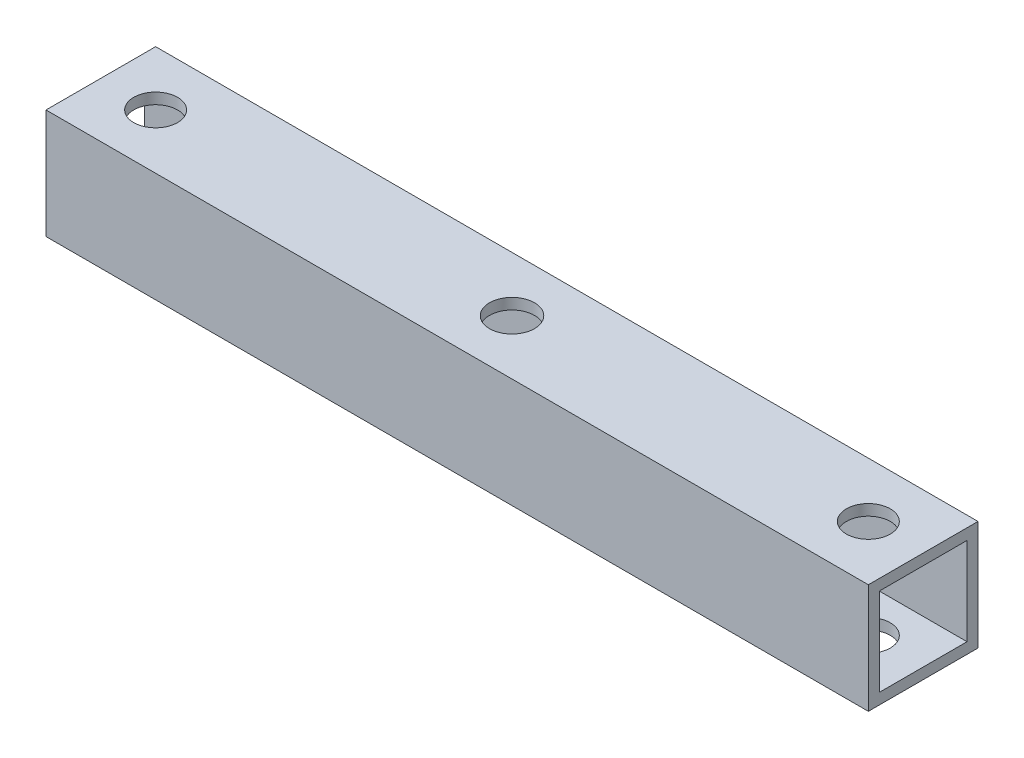
ISO-10303-21;
HEADER;
FILE_DESCRIPTION(('STEP AP214'),'2;1');
FILE_NAME('part.step','',(''),(''),'','','');
FILE_SCHEMA(('AUTOMOTIVE_DESIGN { 1 0 10303 214 1 1 1 1 }'));
ENDSEC;
DATA;
#1=APPLICATION_CONTEXT('core data for automotive mechanical design processes');
#2=APPLICATION_PROTOCOL_DEFINITION('international standard','automotive_design',2000,#1);
#3=PRODUCT_CONTEXT('',#1,'mechanical');
#4=PRODUCT('Part','Part','',(#3));
#5=PRODUCT_RELATED_PRODUCT_CATEGORY('part','',(#4));
#6=PRODUCT_DEFINITION_FORMATION('','',#4);
#7=PRODUCT_DEFINITION_CONTEXT('part definition',#1,'design');
#8=PRODUCT_DEFINITION('design','',#6,#7);
#9=PRODUCT_DEFINITION_SHAPE('','',#8);
#10=(LENGTH_UNIT() NAMED_UNIT(*) SI_UNIT(.MILLI.,.METRE.));
#11=(NAMED_UNIT(*) PLANE_ANGLE_UNIT() SI_UNIT($,.RADIAN.));
#12=(NAMED_UNIT(*) SI_UNIT($,.STERADIAN.) SOLID_ANGLE_UNIT());
#13=UNCERTAINTY_MEASURE_WITH_UNIT(LENGTH_MEASURE(1.E-05),#10,'distance_accuracy_value','');
#14=(GEOMETRIC_REPRESENTATION_CONTEXT(3) GLOBAL_UNCERTAINTY_ASSIGNED_CONTEXT((#13)) GLOBAL_UNIT_ASSIGNED_CONTEXT((#10,
#11,#12)) REPRESENTATION_CONTEXT('',''));
#15=CARTESIAN_POINT('',(0.,0.,0.));
#16=DIRECTION('',(0.,0.,1.));
#17=DIRECTION('',(1.,0.,0.));
#18=AXIS2_PLACEMENT_3D('',#15,#16,#17);
#19=CARTESIAN_POINT('',(150.,0.,0.));
#20=DIRECTION('',(-1.,0.,0.));
#21=DIRECTION('',(0.,0.,1.));
#22=AXIS2_PLACEMENT_3D('',#19,#20,#21);
#23=PLANE('',#22);
#24=DIRECTION('',(0.,1.,0.));
#25=VECTOR('',#24,1.);
#26=CARTESIAN_POINT('',(150.,-10.,-10.));
#27=LINE('',#26,#25);
#28=CARTESIAN_POINT('',(150.,-10.,-10.));
#29=VERTEX_POINT('',#28);
#30=CARTESIAN_POINT('',(150.,10.,-10.));
#31=VERTEX_POINT('',#30);
#32=EDGE_CURVE('E137',#29,#31,#27,.T.);
#33=ORIENTED_EDGE('',*,*,#32,.T.);
#34=DIRECTION('',(0.,0.,1.));
#35=VECTOR('',#34,1.);
#36=CARTESIAN_POINT('',(150.,10.,10.));
#37=LINE('',#36,#35);
#38=CARTESIAN_POINT('',(150.,10.,10.));
#39=VERTEX_POINT('',#38);
#40=EDGE_CURVE('E140',#31,#39,#37,.T.);
#41=ORIENTED_EDGE('',*,*,#40,.T.);
#42=DIRECTION('',(0.,-1.,0.));
#43=VECTOR('',#42,1.);
#44=CARTESIAN_POINT('',(150.,-10.,10.));
#45=LINE('',#44,#43);
#46=CARTESIAN_POINT('',(150.,-10.,10.));
#47=VERTEX_POINT('',#46);
#48=EDGE_CURVE('E143',#39,#47,#45,.T.);
#49=ORIENTED_EDGE('',*,*,#48,.T.);
#50=DIRECTION('',(0.,0.,-1.));
#51=VECTOR('',#50,1.);
#52=CARTESIAN_POINT('',(150.,-10.,10.));
#53=LINE('',#52,#51);
#54=EDGE_CURVE('E145',#47,#29,#53,.T.);
#55=ORIENTED_EDGE('',*,*,#54,.T.);
#56=EDGE_LOOP('',(#33,#41,#49,#55));
#57=FACE_BOUND('',#56,.T.);
#58=DIRECTION('',(0.,0.,-1.));
#59=VECTOR('',#58,1.);
#60=CARTESIAN_POINT('',(150.,-8.,8.));
#61=LINE('',#60,#59);
#62=CARTESIAN_POINT('',(150.,-8.,8.));
#63=VERTEX_POINT('',#62);
#64=CARTESIAN_POINT('',(150.,-8.,-8.));
#65=VERTEX_POINT('',#64);
#66=EDGE_CURVE('E99',#63,#65,#61,.T.);
#67=ORIENTED_EDGE('',*,*,#66,.F.);
#68=DIRECTION('',(0.,-1.,0.));
#69=VECTOR('',#68,1.);
#70=CARTESIAN_POINT('',(150.,-8.,8.));
#71=LINE('',#70,#69);
#72=CARTESIAN_POINT('',(150.,8.,8.));
#73=VERTEX_POINT('',#72);
#74=EDGE_CURVE('E121',#73,#63,#71,.T.);
#75=ORIENTED_EDGE('',*,*,#74,.F.);
#76=DIRECTION('',(0.,0.,1.));
#77=VECTOR('',#76,1.);
#78=CARTESIAN_POINT('',(150.,8.,8.));
#79=LINE('',#78,#77);
#80=CARTESIAN_POINT('',(150.,8.,-8.));
#81=VERTEX_POINT('',#80);
#82=EDGE_CURVE('E119',#81,#73,#79,.T.);
#83=ORIENTED_EDGE('',*,*,#82,.F.);
#84=DIRECTION('',(0.,1.,0.));
#85=VECTOR('',#84,1.);
#86=CARTESIAN_POINT('',(150.,-8.,-8.));
#87=LINE('',#86,#85);
#88=EDGE_CURVE('E107',#65,#81,#87,.T.);
#89=ORIENTED_EDGE('',*,*,#88,.F.);
#90=EDGE_LOOP('',(#67,#75,#83,#89));
#91=FACE_BOUND('',#90,.T.);
#92=ADVANCED_FACE('F32',(#57,#91),#23,.F.);
#93=CARTESIAN_POINT('',(0.,0.,0.));
#94=DIRECTION('',(-1.,0.,0.));
#95=DIRECTION('',(0.,0.,1.));
#96=AXIS2_PLACEMENT_3D('',#93,#94,#95);
#97=PLANE('',#96);
#98=DIRECTION('',(0.,1.,0.));
#99=VECTOR('',#98,1.);
#100=CARTESIAN_POINT('',(0.,-10.,-10.));
#101=LINE('',#100,#99);
#102=CARTESIAN_POINT('',(0.,-10.,-10.));
#103=VERTEX_POINT('',#102);
#104=CARTESIAN_POINT('',(0.,10.,-10.));
#105=VERTEX_POINT('',#104);
#106=EDGE_CURVE('E115',#103,#105,#101,.T.);
#107=ORIENTED_EDGE('',*,*,#106,.F.);
#108=DIRECTION('',(0.,0.,-1.));
#109=VECTOR('',#108,1.);
#110=CARTESIAN_POINT('',(0.,-10.,10.));
#111=LINE('',#110,#109);
#112=CARTESIAN_POINT('',(0.,-10.,10.));
#113=VERTEX_POINT('',#112);
#114=EDGE_CURVE('E141',#113,#103,#111,.T.);
#115=ORIENTED_EDGE('',*,*,#114,.F.);
#116=DIRECTION('',(0.,-1.,0.));
#117=VECTOR('',#116,1.);
#118=CARTESIAN_POINT('',(0.,-10.,10.));
#119=LINE('',#118,#117);
#120=CARTESIAN_POINT('',(0.,10.,10.));
#121=VERTEX_POINT('',#120);
#122=EDGE_CURVE('E152',#121,#113,#119,.T.);
#123=ORIENTED_EDGE('',*,*,#122,.F.);
#124=DIRECTION('',(0.,0.,1.));
#125=VECTOR('',#124,1.);
#126=CARTESIAN_POINT('',(0.,10.,10.));
#127=LINE('',#126,#125);
#128=EDGE_CURVE('E150',#105,#121,#127,.T.);
#129=ORIENTED_EDGE('',*,*,#128,.F.);
#130=EDGE_LOOP('',(#107,#115,#123,#129));
#131=FACE_BOUND('',#130,.T.);
#132=DIRECTION('',(0.,-1.,0.));
#133=VECTOR('',#132,1.);
#134=CARTESIAN_POINT('',(0.,-8.,8.));
#135=LINE('',#134,#133);
#136=CARTESIAN_POINT('',(0.,8.,8.));
#137=VERTEX_POINT('',#136);
#138=CARTESIAN_POINT('',(0.,-8.,8.));
#139=VERTEX_POINT('',#138);
#140=EDGE_CURVE('E108',#137,#139,#135,.T.);
#141=ORIENTED_EDGE('',*,*,#140,.T.);
#142=DIRECTION('',(0.,0.,-1.));
#143=VECTOR('',#142,1.);
#144=CARTESIAN_POINT('',(0.,-8.,8.));
#145=LINE('',#144,#143);
#146=CARTESIAN_POINT('',(0.,-8.,-8.));
#147=VERTEX_POINT('',#146);
#148=EDGE_CURVE('E57',#139,#147,#145,.T.);
#149=ORIENTED_EDGE('',*,*,#148,.T.);
#150=DIRECTION('',(0.,1.,0.));
#151=VECTOR('',#150,1.);
#152=CARTESIAN_POINT('',(0.,-8.,-8.));
#153=LINE('',#152,#151);
#154=CARTESIAN_POINT('',(0.,8.,-8.));
#155=VERTEX_POINT('',#154);
#156=EDGE_CURVE('E114',#147,#155,#153,.T.);
#157=ORIENTED_EDGE('',*,*,#156,.T.);
#158=DIRECTION('',(0.,0.,1.));
#159=VECTOR('',#158,1.);
#160=CARTESIAN_POINT('',(0.,8.,8.));
#161=LINE('',#160,#159);
#162=EDGE_CURVE('E129',#155,#137,#161,.T.);
#163=ORIENTED_EDGE('',*,*,#162,.T.);
#164=EDGE_LOOP('',(#141,#149,#157,#163));
#165=FACE_BOUND('',#164,.T.);
#166=ADVANCED_FACE('F213',(#131,#165),#97,.T.);
#167=CARTESIAN_POINT('',(150.,-10.,-10.));
#168=DIRECTION('',(0.,0.,1.));
#169=DIRECTION('',(1.,0.,0.));
#170=AXIS2_PLACEMENT_3D('',#167,#168,#169);
#171=PLANE('',#170);
#172=ORIENTED_EDGE('',*,*,#106,.T.);
#173=DIRECTION('',(-1.,0.,0.));
#174=VECTOR('',#173,1.);
#175=CARTESIAN_POINT('',(150.,10.,-10.));
#176=LINE('',#175,#174);
#177=EDGE_CURVE('E11',#31,#105,#176,.T.);
#178=ORIENTED_EDGE('',*,*,#177,.F.);
#179=ORIENTED_EDGE('',*,*,#32,.F.);
#180=DIRECTION('',(-1.,0.,0.));
#181=VECTOR('',#180,1.);
#182=CARTESIAN_POINT('',(150.,-10.,-10.));
#183=LINE('',#182,#181);
#184=EDGE_CURVE('E147',#29,#103,#183,.T.);
#185=ORIENTED_EDGE('',*,*,#184,.T.);
#186=EDGE_LOOP('',(#172,#178,#179,#185));
#187=FACE_BOUND('',#186,.T.);
#188=ADVANCED_FACE('F34',(#187),#171,.F.);
#189=CARTESIAN_POINT('',(150.,10.,10.));
#190=DIRECTION('',(0.,-1.,0.));
#191=DIRECTION('',(0.,0.,-1.));
#192=AXIS2_PLACEMENT_3D('',#189,#190,#191);
#193=PLANE('',#192);
#194=CARTESIAN_POINT('',(75.,10.,0.));
#195=DIRECTION('',(0.,1.,0.));
#196=DIRECTION('',(0.,0.,1.));
#197=AXIS2_PLACEMENT_3D('',#194,#195,#196);
#198=CIRCLE('',#197,4.1);
#199=CARTESIAN_POINT('',(75.,10.,4.1));
#200=VERTEX_POINT('',#199);
#201=EDGE_CURVE('E190',#200,#200,#198,.T.);
#202=ORIENTED_EDGE('',*,*,#201,.F.);
#203=EDGE_LOOP('',(#202));
#204=FACE_BOUND('',#203,.T.);
#205=CARTESIAN_POINT('',(10.,10.,0.));
#206=DIRECTION('',(0.,1.,0.));
#207=DIRECTION('',(0.,0.,1.));
#208=AXIS2_PLACEMENT_3D('',#205,#206,#207);
#209=CIRCLE('',#208,4.);
#210=CARTESIAN_POINT('',(10.,10.,4.));
#211=VERTEX_POINT('',#210);
#212=EDGE_CURVE('E183',#211,#211,#209,.T.);
#213=ORIENTED_EDGE('',*,*,#212,.F.);
#214=EDGE_LOOP('',(#213));
#215=FACE_BOUND('',#214,.T.);
#216=CARTESIAN_POINT('',(140.,10.,0.));
#217=DIRECTION('',(0.,1.,0.));
#218=DIRECTION('',(0.,0.,1.));
#219=AXIS2_PLACEMENT_3D('',#216,#217,#218);
#220=CIRCLE('',#219,3.99999999999999);
#221=CARTESIAN_POINT('',(140.,10.,3.99999999999999));
#222=VERTEX_POINT('',#221);
#223=EDGE_CURVE('E176',#222,#222,#220,.T.);
#224=ORIENTED_EDGE('',*,*,#223,.F.);
#225=EDGE_LOOP('',(#224));
#226=FACE_BOUND('',#225,.T.);
#227=ORIENTED_EDGE('',*,*,#128,.T.);
#228=DIRECTION('',(-1.,0.,0.));
#229=VECTOR('',#228,1.);
#230=CARTESIAN_POINT('',(150.,10.,10.));
#231=LINE('',#230,#229);
#232=EDGE_CURVE('E41',#39,#121,#231,.T.);
#233=ORIENTED_EDGE('',*,*,#232,.F.);
#234=ORIENTED_EDGE('',*,*,#40,.F.);
#235=ORIENTED_EDGE('',*,*,#177,.T.);
#236=EDGE_LOOP('',(#227,#233,#234,#235));
#237=FACE_BOUND('',#236,.T.);
#238=ADVANCED_FACE('F240',(#204,#215,#226,#237),#193,.F.);
#239=CARTESIAN_POINT('',(150.,-10.,10.));
#240=DIRECTION('',(0.,0.,-1.));
#241=DIRECTION('',(-1.,0.,0.));
#242=AXIS2_PLACEMENT_3D('',#239,#240,#241);
#243=PLANE('',#242);
#244=ORIENTED_EDGE('',*,*,#122,.T.);
#245=DIRECTION('',(-1.,0.,0.));
#246=VECTOR('',#245,1.);
#247=CARTESIAN_POINT('',(150.,-10.,10.));
#248=LINE('',#247,#246);
#249=EDGE_CURVE('E157',#47,#113,#248,.T.);
#250=ORIENTED_EDGE('',*,*,#249,.F.);
#251=ORIENTED_EDGE('',*,*,#48,.F.);
#252=ORIENTED_EDGE('',*,*,#232,.T.);
#253=EDGE_LOOP('',(#244,#250,#251,#252));
#254=FACE_BOUND('',#253,.T.);
#255=ADVANCED_FACE('F238',(#254),#243,.F.);
#256=CARTESIAN_POINT('',(150.,-10.,10.));
#257=DIRECTION('',(0.,1.,0.));
#258=DIRECTION('',(0.,0.,1.));
#259=AXIS2_PLACEMENT_3D('',#256,#257,#258);
#260=PLANE('',#259);
#261=CARTESIAN_POINT('',(75.,-10.,0.));
#262=DIRECTION('',(0.,1.,0.));
#263=DIRECTION('',(0.,0.,1.));
#264=AXIS2_PLACEMENT_3D('',#261,#262,#263);
#265=CIRCLE('',#264,4.1);
#266=CARTESIAN_POINT('',(75.,-10.,4.1));
#267=VERTEX_POINT('',#266);
#268=EDGE_CURVE('E193',#267,#267,#265,.T.);
#269=ORIENTED_EDGE('',*,*,#268,.T.);
#270=EDGE_LOOP('',(#269));
#271=FACE_BOUND('',#270,.T.);
#272=CARTESIAN_POINT('',(10.,-10.,0.));
#273=DIRECTION('',(0.,1.,0.));
#274=DIRECTION('',(0.,0.,1.));
#275=AXIS2_PLACEMENT_3D('',#272,#273,#274);
#276=CIRCLE('',#275,4.);
#277=CARTESIAN_POINT('',(10.,-10.,4.));
#278=VERTEX_POINT('',#277);
#279=EDGE_CURVE('E165',#278,#278,#276,.T.);
#280=ORIENTED_EDGE('',*,*,#279,.T.);
#281=EDGE_LOOP('',(#280));
#282=FACE_BOUND('',#281,.T.);
#283=CARTESIAN_POINT('',(140.,-10.,0.));
#284=DIRECTION('',(0.,1.,0.));
#285=DIRECTION('',(0.,0.,1.));
#286=AXIS2_PLACEMENT_3D('',#283,#284,#285);
#287=CIRCLE('',#286,3.99999999999999);
#288=CARTESIAN_POINT('',(140.,-10.,3.99999999999999));
#289=VERTEX_POINT('',#288);
#290=EDGE_CURVE('E179',#289,#289,#287,.T.);
#291=ORIENTED_EDGE('',*,*,#290,.T.);
#292=EDGE_LOOP('',(#291));
#293=FACE_BOUND('',#292,.T.);
#294=ORIENTED_EDGE('',*,*,#114,.T.);
#295=ORIENTED_EDGE('',*,*,#184,.F.);
#296=ORIENTED_EDGE('',*,*,#54,.F.);
#297=ORIENTED_EDGE('',*,*,#249,.T.);
#298=EDGE_LOOP('',(#294,#295,#296,#297));
#299=FACE_BOUND('',#298,.T.);
#300=ADVANCED_FACE('F235',(#271,#282,#293,#299),#260,.F.);
#301=CARTESIAN_POINT('',(150.,-8.,8.));
#302=DIRECTION('',(0.,1.,0.));
#303=DIRECTION('',(0.,0.,1.));
#304=AXIS2_PLACEMENT_3D('',#301,#302,#303);
#305=PLANE('',#304);
#306=CARTESIAN_POINT('',(75.,-8.,0.));
#307=DIRECTION('',(0.,1.,0.));
#308=DIRECTION('',(0.,0.,1.));
#309=AXIS2_PLACEMENT_3D('',#306,#307,#308);
#310=CIRCLE('',#309,4.1);
#311=CARTESIAN_POINT('',(75.,-8.,4.1));
#312=VERTEX_POINT('',#311);
#313=EDGE_CURVE('E180',#312,#312,#310,.T.);
#314=ORIENTED_EDGE('',*,*,#313,.F.);
#315=EDGE_LOOP('',(#314));
#316=FACE_BOUND('',#315,.T.);
#317=CARTESIAN_POINT('',(10.,-8.,0.));
#318=DIRECTION('',(0.,1.,0.));
#319=DIRECTION('',(0.,0.,1.));
#320=AXIS2_PLACEMENT_3D('',#317,#318,#319);
#321=CIRCLE('',#320,4.);
#322=CARTESIAN_POINT('',(10.,-8.,4.));
#323=VERTEX_POINT('',#322);
#324=EDGE_CURVE('E127',#323,#323,#321,.T.);
#325=ORIENTED_EDGE('',*,*,#324,.F.);
#326=EDGE_LOOP('',(#325));
#327=FACE_BOUND('',#326,.T.);
#328=CARTESIAN_POINT('',(140.,-8.,0.));
#329=DIRECTION('',(0.,1.,0.));
#330=DIRECTION('',(0.,0.,1.));
#331=AXIS2_PLACEMENT_3D('',#328,#329,#330);
#332=CIRCLE('',#331,3.99999999999999);
#333=CARTESIAN_POINT('',(140.,-8.,3.99999999999999));
#334=VERTEX_POINT('',#333);
#335=EDGE_CURVE('E164',#334,#334,#332,.T.);
#336=ORIENTED_EDGE('',*,*,#335,.F.);
#337=EDGE_LOOP('',(#336));
#338=FACE_BOUND('',#337,.T.);
#339=ORIENTED_EDGE('',*,*,#148,.F.);
#340=DIRECTION('',(-1.,0.,0.));
#341=VECTOR('',#340,1.);
#342=CARTESIAN_POINT('',(150.,-8.,8.));
#343=LINE('',#342,#341);
#344=EDGE_CURVE('E103',#63,#139,#343,.T.);
#345=ORIENTED_EDGE('',*,*,#344,.F.);
#346=ORIENTED_EDGE('',*,*,#66,.T.);
#347=DIRECTION('',(-1.,0.,0.));
#348=VECTOR('',#347,1.);
#349=CARTESIAN_POINT('',(150.,-8.,-8.));
#350=LINE('',#349,#348);
#351=EDGE_CURVE('E102',#65,#147,#350,.T.);
#352=ORIENTED_EDGE('',*,*,#351,.T.);
#353=EDGE_LOOP('',(#339,#345,#346,#352));
#354=FACE_BOUND('',#353,.T.);
#355=ADVANCED_FACE('F101',(#316,#327,#338,#354),#305,.T.);
#356=CARTESIAN_POINT('',(150.,-8.,-8.));
#357=DIRECTION('',(0.,0.,1.));
#358=DIRECTION('',(0.,-1.,0.));
#359=AXIS2_PLACEMENT_3D('',#356,#357,#358);
#360=PLANE('',#359);
#361=ORIENTED_EDGE('',*,*,#156,.F.);
#362=ORIENTED_EDGE('',*,*,#351,.F.);
#363=ORIENTED_EDGE('',*,*,#88,.T.);
#364=DIRECTION('',(-1.,0.,0.));
#365=VECTOR('',#364,1.);
#366=CARTESIAN_POINT('',(150.,8.,-8.));
#367=LINE('',#366,#365);
#368=EDGE_CURVE('E116',#81,#155,#367,.T.);
#369=ORIENTED_EDGE('',*,*,#368,.T.);
#370=EDGE_LOOP('',(#361,#362,#363,#369));
#371=FACE_BOUND('',#370,.T.);
#372=ADVANCED_FACE('F111',(#371),#360,.T.);
#373=CARTESIAN_POINT('',(150.,8.,8.));
#374=DIRECTION('',(0.,-1.,0.));
#375=DIRECTION('',(0.,0.,-1.));
#376=AXIS2_PLACEMENT_3D('',#373,#374,#375);
#377=PLANE('',#376);
#378=CARTESIAN_POINT('',(75.,8.,0.));
#379=DIRECTION('',(0.,-1.,0.));
#380=DIRECTION('',(0.,0.,-1.));
#381=AXIS2_PLACEMENT_3D('',#378,#379,#380);
#382=CIRCLE('',#381,4.1);
#383=CARTESIAN_POINT('',(75.,8.,-4.1));
#384=VERTEX_POINT('',#383);
#385=EDGE_CURVE('E36',#384,#384,#382,.T.);
#386=ORIENTED_EDGE('',*,*,#385,.F.);
#387=EDGE_LOOP('',(#386));
#388=FACE_BOUND('',#387,.T.);
#389=CARTESIAN_POINT('',(10.,8.,0.));
#390=DIRECTION('',(0.,-1.,0.));
#391=DIRECTION('',(0.,0.,-1.));
#392=AXIS2_PLACEMENT_3D('',#389,#390,#391);
#393=CIRCLE('',#392,4.);
#394=CARTESIAN_POINT('',(10.,8.,-4.));
#395=VERTEX_POINT('',#394);
#396=EDGE_CURVE('E166',#395,#395,#393,.T.);
#397=ORIENTED_EDGE('',*,*,#396,.F.);
#398=EDGE_LOOP('',(#397));
#399=FACE_BOUND('',#398,.T.);
#400=CARTESIAN_POINT('',(140.,8.,0.));
#401=DIRECTION('',(0.,-1.,0.));
#402=DIRECTION('',(0.,0.,-1.));
#403=AXIS2_PLACEMENT_3D('',#400,#401,#402);
#404=CIRCLE('',#403,3.99999999999999);
#405=CARTESIAN_POINT('',(140.,8.,-3.99999999999999));
#406=VERTEX_POINT('',#405);
#407=EDGE_CURVE('E162',#406,#406,#404,.T.);
#408=ORIENTED_EDGE('',*,*,#407,.F.);
#409=EDGE_LOOP('',(#408));
#410=FACE_BOUND('',#409,.T.);
#411=ORIENTED_EDGE('',*,*,#162,.F.);
#412=ORIENTED_EDGE('',*,*,#368,.F.);
#413=ORIENTED_EDGE('',*,*,#82,.T.);
#414=DIRECTION('',(-1.,0.,0.));
#415=VECTOR('',#414,1.);
#416=CARTESIAN_POINT('',(150.,8.,8.));
#417=LINE('',#416,#415);
#418=EDGE_CURVE('E49',#73,#137,#417,.T.);
#419=ORIENTED_EDGE('',*,*,#418,.T.);
#420=EDGE_LOOP('',(#411,#412,#413,#419));
#421=FACE_BOUND('',#420,.T.);
#422=ADVANCED_FACE('F203',(#388,#399,#410,#421),#377,.T.);
#423=CARTESIAN_POINT('',(150.,-8.,8.));
#424=DIRECTION('',(0.,0.,-1.));
#425=DIRECTION('',(-1.,0.,0.));
#426=AXIS2_PLACEMENT_3D('',#423,#424,#425);
#427=PLANE('',#426);
#428=ORIENTED_EDGE('',*,*,#140,.F.);
#429=ORIENTED_EDGE('',*,*,#418,.F.);
#430=ORIENTED_EDGE('',*,*,#74,.T.);
#431=ORIENTED_EDGE('',*,*,#344,.T.);
#432=EDGE_LOOP('',(#428,#429,#430,#431));
#433=FACE_BOUND('',#432,.T.);
#434=ADVANCED_FACE('F206',(#433),#427,.T.);
#435=CARTESIAN_POINT('',(140.,-10.,0.));
#436=DIRECTION('',(0.,1.,0.));
#437=DIRECTION('',(0.,0.,1.));
#438=AXIS2_PLACEMENT_3D('',#435,#436,#437);
#439=CYLINDRICAL_SURFACE('',#438,3.99999999999999);
#440=ORIENTED_EDGE('',*,*,#407,.T.);
#441=EDGE_LOOP('',(#440));
#442=FACE_BOUND('',#441,.T.);
#443=ORIENTED_EDGE('',*,*,#223,.T.);
#444=EDGE_LOOP('',(#443));
#445=FACE_BOUND('',#444,.T.);
#446=ADVANCED_FACE('F215',(#442,#445),#439,.F.);
#447=CARTESIAN_POINT('',(10.,-10.,0.));
#448=DIRECTION('',(0.,1.,0.));
#449=DIRECTION('',(0.,0.,1.));
#450=AXIS2_PLACEMENT_3D('',#447,#448,#449);
#451=CYLINDRICAL_SURFACE('',#450,4.);
#452=ORIENTED_EDGE('',*,*,#396,.T.);
#453=EDGE_LOOP('',(#452));
#454=FACE_BOUND('',#453,.T.);
#455=ORIENTED_EDGE('',*,*,#212,.T.);
#456=EDGE_LOOP('',(#455));
#457=FACE_BOUND('',#456,.T.);
#458=ADVANCED_FACE('F220',(#454,#457),#451,.F.);
#459=ORIENTED_EDGE('',*,*,#335,.T.);
#460=EDGE_LOOP('',(#459));
#461=FACE_BOUND('',#460,.T.);
#462=ORIENTED_EDGE('',*,*,#290,.F.);
#463=EDGE_LOOP('',(#462));
#464=FACE_BOUND('',#463,.T.);
#465=ADVANCED_FACE('F223',(#461,#464),#439,.F.);
#466=ORIENTED_EDGE('',*,*,#324,.T.);
#467=EDGE_LOOP('',(#466));
#468=FACE_BOUND('',#467,.T.);
#469=ORIENTED_EDGE('',*,*,#279,.F.);
#470=EDGE_LOOP('',(#469));
#471=FACE_BOUND('',#470,.T.);
#472=ADVANCED_FACE('F269',(#468,#471),#451,.F.);
#473=CARTESIAN_POINT('',(75.,-10.,0.));
#474=DIRECTION('',(0.,1.,0.));
#475=DIRECTION('',(0.,0.,1.));
#476=AXIS2_PLACEMENT_3D('',#473,#474,#475);
#477=CYLINDRICAL_SURFACE('',#476,4.1);
#478=ORIENTED_EDGE('',*,*,#385,.T.);
#479=EDGE_LOOP('',(#478));
#480=FACE_BOUND('',#479,.T.);
#481=ORIENTED_EDGE('',*,*,#201,.T.);
#482=EDGE_LOOP('',(#481));
#483=FACE_BOUND('',#482,.T.);
#484=ADVANCED_FACE('F200',(#480,#483),#477,.F.);
#485=ORIENTED_EDGE('',*,*,#313,.T.);
#486=EDGE_LOOP('',(#485));
#487=FACE_BOUND('',#486,.T.);
#488=ORIENTED_EDGE('',*,*,#268,.F.);
#489=EDGE_LOOP('',(#488));
#490=FACE_BOUND('',#489,.T.);
#491=ADVANCED_FACE('F279',(#487,#490),#477,.F.);
#492=CLOSED_SHELL('',(#92,#166,#188,#238,#255,#300,#355,#372,#422,#434,#446,#458,#465,#472,#484,#491));
#493=MANIFOLD_SOLID_BREP('B2',#492);
#494=ADVANCED_BREP_SHAPE_REPRESENTATION('',(#18,#493),#14);
#495=SHAPE_DEFINITION_REPRESENTATION(#9,#494);
ENDSEC;
END-ISO-10303-21;
